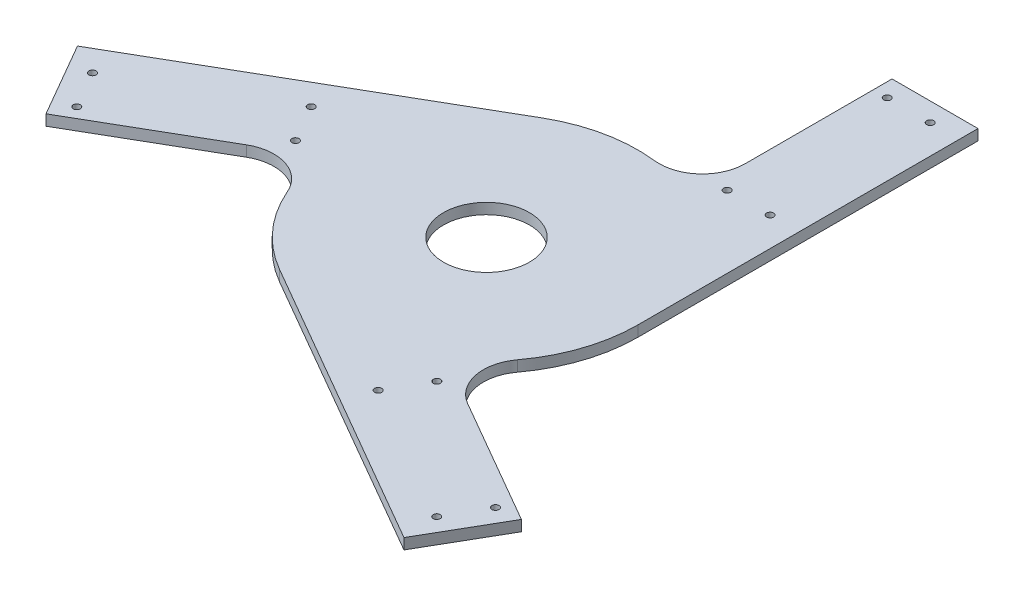
ISO-10303-21;
HEADER;
FILE_DESCRIPTION(('STEP AP214'),'2;1');
FILE_NAME('part.step','',(''),(''),'','','');
FILE_SCHEMA(('AUTOMOTIVE_DESIGN { 1 0 10303 214 1 1 1 1 }'));
ENDSEC;
DATA;
#1=APPLICATION_CONTEXT('core data for automotive mechanical design processes');
#2=APPLICATION_PROTOCOL_DEFINITION('international standard','automotive_design',2000,#1);
#3=PRODUCT_CONTEXT('',#1,'mechanical');
#4=PRODUCT('Part','Part','',(#3));
#5=PRODUCT_RELATED_PRODUCT_CATEGORY('part','',(#4));
#6=PRODUCT_DEFINITION_FORMATION('','',#4);
#7=PRODUCT_DEFINITION_CONTEXT('part definition',#1,'design');
#8=PRODUCT_DEFINITION('design','',#6,#7);
#9=PRODUCT_DEFINITION_SHAPE('','',#8);
#10=(LENGTH_UNIT() NAMED_UNIT(*) SI_UNIT(.MILLI.,.METRE.));
#11=(NAMED_UNIT(*) PLANE_ANGLE_UNIT() SI_UNIT($,.RADIAN.));
#12=(NAMED_UNIT(*) SI_UNIT($,.STERADIAN.) SOLID_ANGLE_UNIT());
#13=UNCERTAINTY_MEASURE_WITH_UNIT(LENGTH_MEASURE(1.E-05),#10,'distance_accuracy_value','');
#14=(GEOMETRIC_REPRESENTATION_CONTEXT(3) GLOBAL_UNCERTAINTY_ASSIGNED_CONTEXT((#13)) GLOBAL_UNIT_ASSIGNED_CONTEXT((#10,
#11,#12)) REPRESENTATION_CONTEXT('',''));
#15=CARTESIAN_POINT('',(0.,0.,0.));
#16=DIRECTION('',(0.,0.,1.));
#17=DIRECTION('',(1.,0.,0.));
#18=AXIS2_PLACEMENT_3D('',#15,#16,#17);
#19=CARTESIAN_POINT('',(30.51,5.,0.));
#20=DIRECTION('',(-1.,0.,0.));
#21=DIRECTION('',(0.,0.,1.));
#22=AXIS2_PLACEMENT_3D('',#19,#20,#21);
#23=PLANE('',#22);
#24=DIRECTION('',(0.,0.,-1.));
#25=VECTOR('',#24,1.);
#26=CARTESIAN_POINT('',(30.51,0.,0.));
#27=LINE('',#26,#25);
#28=CARTESIAN_POINT('',(30.51,0.,-89.8977196596221));
#29=VERTEX_POINT('',#28);
#30=CARTESIAN_POINT('',(30.51,0.,-158.25));
#31=VERTEX_POINT('',#30);
#32=EDGE_CURVE('E176',#29,#31,#27,.T.);
#33=ORIENTED_EDGE('',*,*,#32,.F.);
#34=DIRECTION('',(0.,-1.,0.));
#35=VECTOR('',#34,1.);
#36=CARTESIAN_POINT('',(30.51,5.,-89.8977196596221));
#37=LINE('',#36,#35);
#38=CARTESIAN_POINT('',(30.51,5.,-89.8977196596221));
#39=VERTEX_POINT('',#38);
#40=EDGE_CURVE('E11',#39,#29,#37,.T.);
#41=ORIENTED_EDGE('',*,*,#40,.F.);
#42=DIRECTION('',(0.,0.,-1.));
#43=VECTOR('',#42,1.);
#44=CARTESIAN_POINT('',(30.51,5.,0.));
#45=LINE('',#44,#43);
#46=CARTESIAN_POINT('',(30.51,5.,-158.25));
#47=VERTEX_POINT('',#46);
#48=EDGE_CURVE('E208',#39,#47,#45,.T.);
#49=ORIENTED_EDGE('',*,*,#48,.T.);
#50=DIRECTION('',(0.,-1.,0.));
#51=VECTOR('',#50,1.);
#52=CARTESIAN_POINT('',(30.51,5.,-158.25));
#53=LINE('',#52,#51);
#54=EDGE_CURVE('E55',#47,#31,#53,.T.);
#55=ORIENTED_EDGE('',*,*,#54,.T.);
#56=EDGE_LOOP('',(#33,#41,#49,#55));
#57=FACE_BOUND('',#56,.T.);
#58=ADVANCED_FACE('F39',(#57),#23,.T.);
#59=CARTESIAN_POINT('',(10.51,5.,-89.8977196596221));
#60=DIRECTION('',(0.,-1.,0.));
#61=DIRECTION('',(0.,0.,-1.));
#62=AXIS2_PLACEMENT_3D('',#59,#60,#61);
#63=CYLINDRICAL_SURFACE('',#62,20.);
#64=CARTESIAN_POINT('',(10.51,0.,-89.8977196596221));
#65=DIRECTION('',(0.,1.,0.));
#66=DIRECTION('',(0.,0.,1.));
#67=AXIS2_PLACEMENT_3D('',#64,#65,#66);
#68=CIRCLE('',#67,20.);
#69=CARTESIAN_POINT('',(8.18760468456525,0.,-70.0330152822887));
#70=VERTEX_POINT('',#69);
#71=EDGE_CURVE('E178',#70,#29,#68,.T.);
#72=ORIENTED_EDGE('',*,*,#71,.F.);
#73=DIRECTION('',(0.,-1.,0.));
#74=VECTOR('',#73,1.);
#75=CARTESIAN_POINT('',(8.18760468456525,5.,-70.0330152822887));
#76=LINE('',#75,#74);
#77=CARTESIAN_POINT('',(8.18760468456525,5.,-70.0330152822887));
#78=VERTEX_POINT('',#77);
#79=EDGE_CURVE('E47',#78,#70,#76,.T.);
#80=ORIENTED_EDGE('',*,*,#79,.F.);
#81=CARTESIAN_POINT('',(10.51,5.,-89.8977196596221));
#82=DIRECTION('',(0.,1.,0.));
#83=DIRECTION('',(0.,0.,1.));
#84=AXIS2_PLACEMENT_3D('',#81,#82,#83);
#85=CIRCLE('',#84,20.);
#86=EDGE_CURVE('E251',#78,#39,#85,.T.);
#87=ORIENTED_EDGE('',*,*,#86,.T.);
#88=ORIENTED_EDGE('',*,*,#40,.T.);
#89=EDGE_LOOP('',(#72,#80,#87,#88));
#90=FACE_BOUND('',#89,.T.);
#91=ADVANCED_FACE('F250',(#90),#63,.F.);
#92=CARTESIAN_POINT('',(0.,5.,0.));
#93=DIRECTION('',(0.,-1.,0.));
#94=DIRECTION('',(0.,0.,-1.));
#95=AXIS2_PLACEMENT_3D('',#92,#93,#94);
#96=CYLINDRICAL_SURFACE('',#95,70.51);
#97=CARTESIAN_POINT('',(0.,0.,0.));
#98=DIRECTION('',(0.,1.,0.));
#99=DIRECTION('',(0.,0.,1.));
#100=AXIS2_PLACEMENT_3D('',#97,#98,#99);
#101=CIRCLE('',#100,70.51);
#102=CARTESIAN_POINT('',(-35.255,0.,-61.0634512208408));
#103=VERTEX_POINT('',#102);
#104=EDGE_CURVE('E182',#70,#103,#101,.T.);
#105=ORIENTED_EDGE('',*,*,#104,.T.);
#106=DIRECTION('',(0.,-1.,0.));
#107=VECTOR('',#106,1.);
#108=CARTESIAN_POINT('',(-35.255,5.,-61.0634512208408));
#109=LINE('',#108,#107);
#110=CARTESIAN_POINT('',(-35.255,5.,-61.0634512208408));
#111=VERTEX_POINT('',#110);
#112=EDGE_CURVE('E235',#111,#103,#109,.T.);
#113=ORIENTED_EDGE('',*,*,#112,.F.);
#114=CARTESIAN_POINT('',(0.,5.,0.));
#115=DIRECTION('',(0.,1.,0.));
#116=DIRECTION('',(0.,0.,1.));
#117=AXIS2_PLACEMENT_3D('',#114,#115,#116);
#118=CIRCLE('',#117,70.51);
#119=EDGE_CURVE('E159',#78,#111,#118,.T.);
#120=ORIENTED_EDGE('',*,*,#119,.F.);
#121=ORIENTED_EDGE('',*,*,#79,.T.);
#122=EDGE_LOOP('',(#105,#113,#120,#121));
#123=FACE_BOUND('',#122,.T.);
#124=ADVANCED_FACE('F240',(#123),#96,.T.);
#125=CARTESIAN_POINT('',(-35.255,5.,-61.0634512208408));
#126=DIRECTION('',(0.5,0.,0.866025403784439));
#127=DIRECTION('',(0.866025403784439,0.,-0.5));
#128=AXIS2_PLACEMENT_3D('',#125,#126,#127);
#129=PLANE('',#128);
#130=DIRECTION('',(-0.866025403784439,0.,0.5));
#131=VECTOR('',#130,1.);
#132=CARTESIAN_POINT('',(-35.255,0.,-61.0634512208408));
#133=LINE('',#132,#131);
#134=CARTESIAN_POINT('',(-172.303520148887,0.,18.0615487791592));
#135=VERTEX_POINT('',#134);
#136=EDGE_CURVE('E184',#103,#135,#133,.T.);
#137=ORIENTED_EDGE('',*,*,#136,.T.);
#138=DIRECTION('',(0.,-1.,0.));
#139=VECTOR('',#138,1.);
#140=CARTESIAN_POINT('',(-172.303520148887,5.,18.0615487791592));
#141=LINE('',#140,#139);
#142=CARTESIAN_POINT('',(-172.303520148887,5.,18.0615487791592));
#143=VERTEX_POINT('',#142);
#144=EDGE_CURVE('E232',#143,#135,#141,.T.);
#145=ORIENTED_EDGE('',*,*,#144,.F.);
#146=DIRECTION('',(-0.866025403784439,0.,0.5));
#147=VECTOR('',#146,1.);
#148=CARTESIAN_POINT('',(-35.255,5.,-61.0634512208408));
#149=LINE('',#148,#147);
#150=EDGE_CURVE('E337',#111,#143,#149,.T.);
#151=ORIENTED_EDGE('',*,*,#150,.F.);
#152=ORIENTED_EDGE('',*,*,#112,.T.);
#153=EDGE_LOOP('',(#137,#145,#151,#152));
#154=FACE_BOUND('',#153,.T.);
#155=ADVANCED_FACE('F270',(#154),#129,.F.);
#156=CARTESIAN_POINT('',(-137.048520148887,5.,79.125));
#157=DIRECTION('',(0.866025403784438,0.,-0.5));
#158=DIRECTION('',(-0.5,0.,-0.866025403784438));
#159=AXIS2_PLACEMENT_3D('',#156,#157,#158);
#160=PLANE('',#159);
#161=DIRECTION('',(0.5,0.,0.866025403784438));
#162=VECTOR('',#161,1.);
#163=CARTESIAN_POINT('',(-137.048520148887,0.,79.125));
#164=LINE('',#163,#162);
#165=CARTESIAN_POINT('',(-152.303520148887,0.,52.7025649305367));
#166=VERTEX_POINT('',#165);
#167=EDGE_CURVE('E187',#135,#166,#164,.T.);
#168=ORIENTED_EDGE('',*,*,#167,.T.);
#169=DIRECTION('',(0.,-1.,0.));
#170=VECTOR('',#169,1.);
#171=CARTESIAN_POINT('',(-152.303520148887,5.,52.7025649305367));
#172=LINE('',#171,#170);
#173=CARTESIAN_POINT('',(-152.303520148887,5.,52.7025649305367));
#174=VERTEX_POINT('',#173);
#175=EDGE_CURVE('E229',#174,#166,#172,.T.);
#176=ORIENTED_EDGE('',*,*,#175,.F.);
#177=DIRECTION('',(0.5,0.,0.866025403784438));
#178=VECTOR('',#177,1.);
#179=CARTESIAN_POINT('',(-137.048520148887,5.,79.125));
#180=LINE('',#179,#178);
#181=EDGE_CURVE('E335',#143,#174,#180,.T.);
#182=ORIENTED_EDGE('',*,*,#181,.F.);
#183=ORIENTED_EDGE('',*,*,#144,.T.);
#184=EDGE_LOOP('',(#168,#176,#182,#183));
#185=FACE_BOUND('',#184,.T.);
#186=ADVANCED_FACE('F276',(#185),#160,.F.);
#187=CARTESIAN_POINT('',(-15.255,5.,-26.4224350694632));
#188=DIRECTION('',(-0.5,0.,-0.866025403784439));
#189=DIRECTION('',(-0.866025403784439,0.,0.5));
#190=AXIS2_PLACEMENT_3D('',#187,#188,#189);
#191=PLANE('',#190);
#192=DIRECTION('',(0.866025403784439,0.,-0.5));
#193=VECTOR('',#192,1.);
#194=CARTESIAN_POINT('',(-15.255,0.,-26.4224350694632));
#195=LINE('',#194,#193);
#196=CARTESIAN_POINT('',(-93.1087089675245,0.,18.5264247603478));
#197=VERTEX_POINT('',#196);
#198=EDGE_CURVE('E189',#166,#197,#195,.T.);
#199=ORIENTED_EDGE('',*,*,#198,.T.);
#200=DIRECTION('',(0.,-1.,0.));
#201=VECTOR('',#200,1.);
#202=CARTESIAN_POINT('',(-93.1087089675245,5.,18.5264247603478));
#203=LINE('',#202,#201);
#204=CARTESIAN_POINT('',(-93.1087089675245,5.,18.5264247603478));
#205=VERTEX_POINT('',#204);
#206=EDGE_CURVE('E226',#205,#197,#203,.T.);
#207=ORIENTED_EDGE('',*,*,#206,.F.);
#208=DIRECTION('',(0.866025403784439,0.,-0.5));
#209=VECTOR('',#208,1.);
#210=CARTESIAN_POINT('',(-15.255,5.,-26.4224350694632));
#211=LINE('',#210,#209);
#212=EDGE_CURVE('E333',#174,#205,#211,.T.);
#213=ORIENTED_EDGE('',*,*,#212,.F.);
#214=ORIENTED_EDGE('',*,*,#175,.T.);
#215=EDGE_LOOP('',(#199,#207,#213,#214));
#216=FACE_BOUND('',#215,.T.);
#217=ADVANCED_FACE('F280',(#216),#191,.F.);
#218=CARTESIAN_POINT('',(-83.1087089675245,5.,35.8469328360366));
#219=DIRECTION('',(0.,-1.,0.));
#220=DIRECTION('',(0.,0.,-1.));
#221=AXIS2_PLACEMENT_3D('',#218,#219,#220);
#222=CYLINDRICAL_SURFACE('',#221,20.);
#223=CARTESIAN_POINT('',(-83.1087089675245,0.,35.8469328360366));
#224=DIRECTION('',(0.,1.,0.));
#225=DIRECTION('',(0.,0.,1.));
#226=AXIS2_PLACEMENT_3D('',#223,#224,#225);
#227=CIRCLE('',#226,20.);
#228=CARTESIAN_POINT('',(-64.7441726803685,0.,27.9258339881664));
#229=VERTEX_POINT('',#228);
#230=EDGE_CURVE('E191',#197,#229,#227,.F.);
#231=ORIENTED_EDGE('',*,*,#230,.T.);
#232=DIRECTION('',(0.,-1.,0.));
#233=VECTOR('',#232,1.);
#234=CARTESIAN_POINT('',(-64.7441726803685,5.,27.9258339881664));
#235=LINE('',#234,#233);
#236=CARTESIAN_POINT('',(-64.7441726803685,5.,27.9258339881664));
#237=VERTEX_POINT('',#236);
#238=EDGE_CURVE('E223',#237,#229,#235,.T.);
#239=ORIENTED_EDGE('',*,*,#238,.F.);
#240=CARTESIAN_POINT('',(-83.1087089675245,5.,35.8469328360366));
#241=DIRECTION('',(0.,1.,0.));
#242=DIRECTION('',(0.,0.,1.));
#243=AXIS2_PLACEMENT_3D('',#240,#241,#242);
#244=CIRCLE('',#243,20.);
#245=EDGE_CURVE('E331',#205,#237,#244,.F.);
#246=ORIENTED_EDGE('',*,*,#245,.F.);
#247=ORIENTED_EDGE('',*,*,#206,.T.);
#248=EDGE_LOOP('',(#231,#239,#246,#247));
#249=FACE_BOUND('',#248,.T.);
#250=ADVANCED_FACE('F284',(#249),#222,.F.);
#251=CARTESIAN_POINT('',(-35.2549999999998,0.,61.0634512208409));
#252=VERTEX_POINT('',#251);
#253=EDGE_CURVE('E185',#229,#252,#101,.T.);
#254=ORIENTED_EDGE('',*,*,#253,.T.);
#255=DIRECTION('',(0.,-1.,0.));
#256=VECTOR('',#255,1.);
#257=CARTESIAN_POINT('',(-35.2549999999998,5.,61.0634512208409));
#258=LINE('',#257,#256);
#259=CARTESIAN_POINT('',(-35.2549999999998,5.,61.0634512208409));
#260=VERTEX_POINT('',#259);
#261=EDGE_CURVE('E220',#260,#252,#258,.T.);
#262=ORIENTED_EDGE('',*,*,#261,.F.);
#263=EDGE_CURVE('E158',#237,#260,#118,.T.);
#264=ORIENTED_EDGE('',*,*,#263,.F.);
#265=ORIENTED_EDGE('',*,*,#238,.T.);
#266=EDGE_LOOP('',(#254,#262,#264,#265));
#267=FACE_BOUND('',#266,.T.);
#268=ADVANCED_FACE('F272',(#267),#96,.T.);
#269=CARTESIAN_POINT('',(-35.2549999999998,5.,61.0634512208409));
#270=DIRECTION('',(0.499999999999998,0.,-0.86602540378444));
#271=DIRECTION('',(-0.86602540378444,0.,-0.499999999999998));
#272=AXIS2_PLACEMENT_3D('',#269,#270,#271);
#273=PLANE('',#272);
#274=DIRECTION('',(0.86602540378444,0.,0.499999999999998));
#275=VECTOR('',#274,1.);
#276=CARTESIAN_POINT('',(-35.2549999999998,0.,61.0634512208409));
#277=LINE('',#276,#275);
#278=CARTESIAN_POINT('',(101.793520148888,0.,140.188451220841));
#279=VERTEX_POINT('',#278);
#280=EDGE_CURVE('E193',#252,#279,#277,.T.);
#281=ORIENTED_EDGE('',*,*,#280,.T.);
#282=DIRECTION('',(0.,-1.,0.));
#283=VECTOR('',#282,1.);
#284=CARTESIAN_POINT('',(101.793520148888,5.,140.188451220841));
#285=LINE('',#284,#283);
#286=CARTESIAN_POINT('',(101.793520148888,5.,140.188451220841));
#287=VERTEX_POINT('',#286);
#288=EDGE_CURVE('E217',#287,#279,#285,.T.);
#289=ORIENTED_EDGE('',*,*,#288,.F.);
#290=DIRECTION('',(0.86602540378444,0.,0.499999999999998));
#291=VECTOR('',#290,1.);
#292=CARTESIAN_POINT('',(-35.2549999999998,5.,61.0634512208409));
#293=LINE('',#292,#291);
#294=EDGE_CURVE('E319',#260,#287,#293,.T.);
#295=ORIENTED_EDGE('',*,*,#294,.F.);
#296=ORIENTED_EDGE('',*,*,#261,.T.);
#297=EDGE_LOOP('',(#281,#289,#295,#296));
#298=FACE_BOUND('',#297,.T.);
#299=ADVANCED_FACE('F289',(#298),#273,.F.);
#300=CARTESIAN_POINT('',(137.048520148888,5.,79.1249999999997));
#301=DIRECTION('',(-0.86602540378444,0.,-0.499999999999998));
#302=DIRECTION('',(-0.499999999999998,0.,0.86602540378444));
#303=AXIS2_PLACEMENT_3D('',#300,#301,#302);
#304=PLANE('',#303);
#305=DIRECTION('',(0.499999999999998,0.,-0.86602540378444));
#306=VECTOR('',#305,1.);
#307=CARTESIAN_POINT('',(137.048520148888,0.,79.1249999999997));
#308=LINE('',#307,#306);
#309=CARTESIAN_POINT('',(121.793520148888,0.,105.547435069463));
#310=VERTEX_POINT('',#309);
#311=EDGE_CURVE('E195',#279,#310,#308,.T.);
#312=ORIENTED_EDGE('',*,*,#311,.T.);
#313=DIRECTION('',(0.,-1.,0.));
#314=VECTOR('',#313,1.);
#315=CARTESIAN_POINT('',(121.793520148888,5.,105.547435069463));
#316=LINE('',#315,#314);
#317=CARTESIAN_POINT('',(121.793520148888,5.,105.547435069463));
#318=VERTEX_POINT('',#317);
#319=EDGE_CURVE('E214',#318,#310,#316,.T.);
#320=ORIENTED_EDGE('',*,*,#319,.F.);
#321=DIRECTION('',(0.499999999999998,0.,-0.86602540378444));
#322=VECTOR('',#321,1.);
#323=CARTESIAN_POINT('',(137.048520148888,5.,79.1249999999997));
#324=LINE('',#323,#322);
#325=EDGE_CURVE('E327',#287,#318,#324,.T.);
#326=ORIENTED_EDGE('',*,*,#325,.F.);
#327=ORIENTED_EDGE('',*,*,#288,.T.);
#328=EDGE_LOOP('',(#312,#320,#326,#327));
#329=FACE_BOUND('',#328,.T.);
#330=ADVANCED_FACE('F292',(#329),#304,.F.);
#331=CARTESIAN_POINT('',(-15.2549999999999,5.,26.4224350694633));
#332=DIRECTION('',(-0.499999999999998,0.,0.86602540378444));
#333=DIRECTION('',(0.86602540378444,0.,0.499999999999998));
#334=AXIS2_PLACEMENT_3D('',#331,#332,#333);
#335=PLANE('',#334);
#336=DIRECTION('',(-0.86602540378444,0.,-0.499999999999998));
#337=VECTOR('',#336,1.);
#338=CARTESIAN_POINT('',(-15.2549999999999,0.,26.4224350694633));
#339=LINE('',#338,#337);
#340=CARTESIAN_POINT('',(62.5987089675247,0.,71.3712948992741));
#341=VERTEX_POINT('',#340);
#342=EDGE_CURVE('E197',#310,#341,#339,.T.);
#343=ORIENTED_EDGE('',*,*,#342,.T.);
#344=DIRECTION('',(0.,-1.,0.));
#345=VECTOR('',#344,1.);
#346=CARTESIAN_POINT('',(62.5987089675247,5.,71.3712948992741));
#347=LINE('',#346,#345);
#348=CARTESIAN_POINT('',(62.5987089675247,5.,71.3712948992741));
#349=VERTEX_POINT('',#348);
#350=EDGE_CURVE('E212',#349,#341,#347,.T.);
#351=ORIENTED_EDGE('',*,*,#350,.F.);
#352=DIRECTION('',(-0.86602540378444,0.,-0.499999999999998));
#353=VECTOR('',#352,1.);
#354=CARTESIAN_POINT('',(-15.2549999999999,5.,26.4224350694633));
#355=LINE('',#354,#353);
#356=EDGE_CURVE('E326',#318,#349,#355,.T.);
#357=ORIENTED_EDGE('',*,*,#356,.F.);
#358=ORIENTED_EDGE('',*,*,#319,.T.);
#359=EDGE_LOOP('',(#343,#351,#357,#358));
#360=FACE_BOUND('',#359,.T.);
#361=ADVANCED_FACE('F296',(#360),#335,.F.);
#362=CARTESIAN_POINT('',(72.5987089675246,5.,54.0507868235853));
#363=DIRECTION('',(0.,-1.,0.));
#364=DIRECTION('',(0.,0.,-1.));
#365=AXIS2_PLACEMENT_3D('',#362,#363,#364);
#366=CYLINDRICAL_SURFACE('',#365,20.);
#367=CARTESIAN_POINT('',(72.5987089675246,0.,54.0507868235853));
#368=DIRECTION('',(0.,1.,0.));
#369=DIRECTION('',(0.,0.,1.));
#370=AXIS2_PLACEMENT_3D('',#367,#368,#369);
#371=CIRCLE('',#370,20.);
#372=CARTESIAN_POINT('',(56.5565679958033,0.,42.1071812941222));
#373=VERTEX_POINT('',#372);
#374=EDGE_CURVE('E200',#373,#341,#371,.T.);
#375=ORIENTED_EDGE('',*,*,#374,.F.);
#376=DIRECTION('',(0.,-1.,0.));
#377=VECTOR('',#376,1.);
#378=CARTESIAN_POINT('',(56.5565679958033,5.,42.1071812941222));
#379=LINE('',#378,#377);
#380=CARTESIAN_POINT('',(56.5565679958033,5.,42.1071812941222));
#381=VERTEX_POINT('',#380);
#382=EDGE_CURVE('E167',#381,#373,#379,.T.);
#383=ORIENTED_EDGE('',*,*,#382,.F.);
#384=CARTESIAN_POINT('',(72.5987089675246,5.,54.0507868235853));
#385=DIRECTION('',(0.,1.,0.));
#386=DIRECTION('',(0.,0.,1.));
#387=AXIS2_PLACEMENT_3D('',#384,#385,#386);
#388=CIRCLE('',#387,20.);
#389=EDGE_CURVE('E155',#381,#349,#388,.T.);
#390=ORIENTED_EDGE('',*,*,#389,.T.);
#391=ORIENTED_EDGE('',*,*,#350,.T.);
#392=EDGE_LOOP('',(#375,#383,#390,#391));
#393=FACE_BOUND('',#392,.T.);
#394=ADVANCED_FACE('F300',(#393),#366,.F.);
#395=CARTESIAN_POINT('',(70.51,0.,0.));
#396=VERTEX_POINT('',#395);
#397=EDGE_CURVE('E164',#373,#396,#101,.T.);
#398=ORIENTED_EDGE('',*,*,#397,.T.);
#399=DIRECTION('',(0.,-1.,0.));
#400=VECTOR('',#399,1.);
#401=CARTESIAN_POINT('',(70.51,5.,0.));
#402=LINE('',#401,#400);
#403=CARTESIAN_POINT('',(70.51,5.,0.));
#404=VERTEX_POINT('',#403);
#405=EDGE_CURVE('E161',#404,#396,#402,.T.);
#406=ORIENTED_EDGE('',*,*,#405,.F.);
#407=EDGE_CURVE('E148',#381,#404,#118,.T.);
#408=ORIENTED_EDGE('',*,*,#407,.F.);
#409=ORIENTED_EDGE('',*,*,#382,.T.);
#410=EDGE_LOOP('',(#398,#406,#408,#409));
#411=FACE_BOUND('',#410,.T.);
#412=ADVANCED_FACE('F162',(#411),#96,.T.);
#413=CARTESIAN_POINT('',(70.51,5.,0.));
#414=DIRECTION('',(1.,0.,0.));
#415=DIRECTION('',(0.,0.,-1.));
#416=AXIS2_PLACEMENT_3D('',#413,#414,#415);
#417=PLANE('',#416);
#418=DIRECTION('',(0.,0.,1.));
#419=VECTOR('',#418,1.);
#420=CARTESIAN_POINT('',(70.51,0.,0.));
#421=LINE('',#420,#419);
#422=CARTESIAN_POINT('',(70.51,0.,-158.25));
#423=VERTEX_POINT('',#422);
#424=EDGE_CURVE('E203',#423,#396,#421,.T.);
#425=ORIENTED_EDGE('',*,*,#424,.F.);
#426=DIRECTION('',(0.,-1.,0.));
#427=VECTOR('',#426,1.);
#428=CARTESIAN_POINT('',(70.51,5.,-158.25));
#429=LINE('',#428,#427);
#430=CARTESIAN_POINT('',(70.51,5.,-158.25));
#431=VERTEX_POINT('',#430);
#432=EDGE_CURVE('E101',#431,#423,#429,.T.);
#433=ORIENTED_EDGE('',*,*,#432,.F.);
#434=DIRECTION('',(0.,0.,1.));
#435=VECTOR('',#434,1.);
#436=CARTESIAN_POINT('',(70.51,5.,0.));
#437=LINE('',#436,#435);
#438=EDGE_CURVE('E153',#431,#404,#437,.T.);
#439=ORIENTED_EDGE('',*,*,#438,.T.);
#440=ORIENTED_EDGE('',*,*,#405,.T.);
#441=EDGE_LOOP('',(#425,#433,#439,#440));
#442=FACE_BOUND('',#441,.T.);
#443=ADVANCED_FACE('F169',(#442),#417,.T.);
#444=CARTESIAN_POINT('',(0.,5.,-158.25));
#445=DIRECTION('',(0.,0.,-1.));
#446=DIRECTION('',(-1.,0.,0.));
#447=AXIS2_PLACEMENT_3D('',#444,#445,#446);
#448=PLANE('',#447);
#449=DIRECTION('',(1.,0.,0.));
#450=VECTOR('',#449,1.);
#451=CARTESIAN_POINT('',(0.,0.,-158.25));
#452=LINE('',#451,#450);
#453=EDGE_CURVE('E205',#31,#423,#452,.T.);
#454=ORIENTED_EDGE('',*,*,#453,.F.);
#455=ORIENTED_EDGE('',*,*,#54,.F.);
#456=DIRECTION('',(1.,0.,0.));
#457=VECTOR('',#456,1.);
#458=CARTESIAN_POINT('',(0.,5.,-158.25));
#459=LINE('',#458,#457);
#460=EDGE_CURVE('E170',#47,#431,#459,.T.);
#461=ORIENTED_EDGE('',*,*,#460,.T.);
#462=ORIENTED_EDGE('',*,*,#432,.T.);
#463=EDGE_LOOP('',(#454,#455,#461,#462));
#464=FACE_BOUND('',#463,.T.);
#465=ADVANCED_FACE('F252',(#464),#448,.T.);
#466=CARTESIAN_POINT('',(0.,5.,0.));
#467=DIRECTION('',(0.,1.,0.));
#468=DIRECTION('',(0.,0.,1.));
#469=AXIS2_PLACEMENT_3D('',#466,#467,#468);
#470=PLANE('',#469);
#471=CARTESIAN_POINT('',(57.01,5.,-149.5));
#472=DIRECTION('',(0.,1.,0.));
#473=DIRECTION('',(0.,0.,1.));
#474=AXIS2_PLACEMENT_3D('',#471,#472,#473);
#475=CIRCLE('',#474,1.65);
#476=CARTESIAN_POINT('',(57.01,5.,-147.85));
#477=VERTEX_POINT('',#476);
#478=EDGE_CURVE('E415',#477,#477,#475,.T.);
#479=ORIENTED_EDGE('',*,*,#478,.F.);
#480=EDGE_LOOP('',(#479));
#481=FACE_BOUND('',#480,.T.);
#482=CARTESIAN_POINT('',(37.01,5.,-75.));
#483=DIRECTION('',(0.,1.,0.));
#484=DIRECTION('',(0.,0.,1.));
#485=AXIS2_PLACEMENT_3D('',#482,#483,#484);
#486=CIRCLE('',#485,1.65);
#487=CARTESIAN_POINT('',(37.01,5.,-73.35));
#488=VERTEX_POINT('',#487);
#489=EDGE_CURVE('E409',#488,#488,#486,.T.);
#490=ORIENTED_EDGE('',*,*,#489,.F.);
#491=EDGE_LOOP('',(#490));
#492=FACE_BOUND('',#491,.T.);
#493=CARTESIAN_POINT('',(37.01,5.,-149.5));
#494=DIRECTION('',(0.,1.,0.));
#495=DIRECTION('',(0.,0.,1.));
#496=AXIS2_PLACEMENT_3D('',#493,#494,#495);
#497=CIRCLE('',#496,1.65);
#498=CARTESIAN_POINT('',(37.01,5.,-147.85));
#499=VERTEX_POINT('',#498);
#500=EDGE_CURVE('E403',#499,#499,#497,.T.);
#501=ORIENTED_EDGE('',*,*,#500,.F.);
#502=EDGE_LOOP('',(#501));
#503=FACE_BOUND('',#502,.T.);
#504=CARTESIAN_POINT('',(57.01,5.,-75.));
#505=DIRECTION('',(0.,1.,0.));
#506=DIRECTION('',(0.,0.,1.));
#507=AXIS2_PLACEMENT_3D('',#504,#505,#506);
#508=CIRCLE('',#507,1.65);
#509=CARTESIAN_POINT('',(57.01,5.,-73.35));
#510=VERTEX_POINT('',#509);
#511=EDGE_CURVE('E397',#510,#510,#508,.T.);
#512=ORIENTED_EDGE('',*,*,#511,.F.);
#513=EDGE_LOOP('',(#512));
#514=FACE_BOUND('',#513,.T.);
#515=CARTESIAN_POINT('',(100.965797865794,5.,124.122108269751));
#516=DIRECTION('',(0.,1.,0.));
#517=DIRECTION('',(0.,0.,1.));
#518=AXIS2_PLACEMENT_3D('',#515,#516,#517);
#519=CIRCLE('',#518,1.65);
#520=CARTESIAN_POINT('',(100.965797865794,5.,125.772108269751));
#521=VERTEX_POINT('',#520);
#522=EDGE_CURVE('E391',#521,#521,#519,.T.);
#523=ORIENTED_EDGE('',*,*,#522,.F.);
#524=EDGE_LOOP('',(#523));
#525=FACE_BOUND('',#524,.T.);
#526=CARTESIAN_POINT('',(46.4469052838537,5.,69.5516001940621));
#527=DIRECTION('',(0.,1.,0.));
#528=DIRECTION('',(0.,0.,1.));
#529=AXIS2_PLACEMENT_3D('',#526,#527,#528);
#530=CIRCLE('',#529,1.65);
#531=CARTESIAN_POINT('',(46.4469052838537,5.,71.2016001940621));
#532=VERTEX_POINT('',#531);
#533=EDGE_CURVE('E385',#532,#532,#530,.T.);
#534=ORIENTED_EDGE('',*,*,#533,.F.);
#535=EDGE_LOOP('',(#534));
#536=FACE_BOUND('',#535,.T.);
#537=CARTESIAN_POINT('',(110.965797865794,5.,106.801600194062));
#538=DIRECTION('',(0.,1.,0.));
#539=DIRECTION('',(0.,0.,1.));
#540=AXIS2_PLACEMENT_3D('',#537,#538,#539);
#541=CIRCLE('',#540,1.65);
#542=CARTESIAN_POINT('',(110.965797865794,5.,108.451600194062));
#543=VERTEX_POINT('',#542);
#544=EDGE_CURVE('E379',#543,#543,#541,.T.);
#545=ORIENTED_EDGE('',*,*,#544,.F.);
#546=EDGE_LOOP('',(#545));
#547=FACE_BOUND('',#546,.T.);
#548=CARTESIAN_POINT('',(36.4469052838537,5.,86.8721082697509));
#549=DIRECTION('',(0.,1.,0.));
#550=DIRECTION('',(0.,0.,1.));
#551=AXIS2_PLACEMENT_3D('',#548,#549,#550);
#552=CIRCLE('',#551,1.65);
#553=CARTESIAN_POINT('',(36.4469052838537,5.,88.5221082697509));
#554=VERTEX_POINT('',#553);
#555=EDGE_CURVE('E373',#554,#554,#552,.T.);
#556=ORIENTED_EDGE('',*,*,#555,.F.);
#557=EDGE_LOOP('',(#556));
#558=FACE_BOUND('',#557,.T.);
#559=CARTESIAN_POINT('',(-157.975797865763,5.,25.3778917302671));
#560=DIRECTION('',(0.,1.,0.));
#561=DIRECTION('',(0.,0.,1.));
#562=AXIS2_PLACEMENT_3D('',#559,#560,#561);
#563=CIRCLE('',#562,1.65000000000001);
#564=CARTESIAN_POINT('',(-157.975797865763,5.,27.0278917302672));
#565=VERTEX_POINT('',#564);
#566=EDGE_CURVE('E367',#565,#565,#563,.T.);
#567=ORIENTED_EDGE('',*,*,#566,.F.);
#568=EDGE_LOOP('',(#567));
#569=FACE_BOUND('',#568,.T.);
#570=CARTESIAN_POINT('',(-83.4569052838226,5.,5.44839980595592));
#571=DIRECTION('',(0.,1.,0.));
#572=DIRECTION('',(0.,0.,1.));
#573=AXIS2_PLACEMENT_3D('',#570,#571,#572);
#574=CIRCLE('',#573,1.65);
#575=CARTESIAN_POINT('',(-83.4569052838226,5.,7.09839980595592));
#576=VERTEX_POINT('',#575);
#577=EDGE_CURVE('E361',#576,#576,#574,.T.);
#578=ORIENTED_EDGE('',*,*,#577,.F.);
#579=EDGE_LOOP('',(#578));
#580=FACE_BOUND('',#579,.T.);
#581=CARTESIAN_POINT('',(-147.975797865763,5.,42.6983998059559));
#582=DIRECTION('',(0.,1.,0.));
#583=DIRECTION('',(0.,0.,1.));
#584=AXIS2_PLACEMENT_3D('',#581,#582,#583);
#585=CIRCLE('',#584,1.65000000000001);
#586=CARTESIAN_POINT('',(-147.975797865763,5.,44.3483998059559));
#587=VERTEX_POINT('',#586);
#588=EDGE_CURVE('E355',#587,#587,#585,.T.);
#589=ORIENTED_EDGE('',*,*,#588,.F.);
#590=EDGE_LOOP('',(#589));
#591=FACE_BOUND('',#590,.T.);
#592=CARTESIAN_POINT('',(-93.4569052838226,5.,-11.8721082697329));
#593=DIRECTION('',(0.,1.,0.));
#594=DIRECTION('',(0.,0.,1.));
#595=AXIS2_PLACEMENT_3D('',#592,#593,#594);
#596=CIRCLE('',#595,1.65);
#597=CARTESIAN_POINT('',(-93.4569052838226,5.,-10.2221082697329));
#598=VERTEX_POINT('',#597);
#599=EDGE_CURVE('E349',#598,#598,#596,.T.);
#600=ORIENTED_EDGE('',*,*,#599,.F.);
#601=EDGE_LOOP('',(#600));
#602=FACE_BOUND('',#601,.T.);
#603=CARTESIAN_POINT('',(0.,5.,0.));
#604=DIRECTION('',(0.,1.,0.));
#605=DIRECTION('',(0.,0.,1.));
#606=AXIS2_PLACEMENT_3D('',#603,#604,#605);
#607=CIRCLE('',#606,20.);
#608=CARTESIAN_POINT('',(0.,5.,20.));
#609=VERTEX_POINT('',#608);
#610=EDGE_CURVE('E341',#609,#609,#607,.T.);
#611=ORIENTED_EDGE('',*,*,#610,.F.);
#612=EDGE_LOOP('',(#611));
#613=FACE_BOUND('',#612,.T.);
#614=ORIENTED_EDGE('',*,*,#48,.F.);
#615=ORIENTED_EDGE('',*,*,#86,.F.);
#616=ORIENTED_EDGE('',*,*,#119,.T.);
#617=ORIENTED_EDGE('',*,*,#150,.T.);
#618=ORIENTED_EDGE('',*,*,#181,.T.);
#619=ORIENTED_EDGE('',*,*,#212,.T.);
#620=ORIENTED_EDGE('',*,*,#245,.T.);
#621=ORIENTED_EDGE('',*,*,#263,.T.);
#622=ORIENTED_EDGE('',*,*,#294,.T.);
#623=ORIENTED_EDGE('',*,*,#325,.T.);
#624=ORIENTED_EDGE('',*,*,#356,.T.);
#625=ORIENTED_EDGE('',*,*,#389,.F.);
#626=ORIENTED_EDGE('',*,*,#407,.T.);
#627=ORIENTED_EDGE('',*,*,#438,.F.);
#628=ORIENTED_EDGE('',*,*,#460,.F.);
#629=EDGE_LOOP('',(#614,#615,#616,#617,#618,#619,#620,#621,#622,#623,#624,#625,#626,#627,#628));
#630=FACE_BOUND('',#629,.T.);
#631=ADVANCED_FACE('F150',(#481,#492,#503,#514,#525,#536,#547,#558,#569,#580,#591,#602,#613,
#630),#470,.T.);
#632=CARTESIAN_POINT('',(0.,0.,0.));
#633=DIRECTION('',(0.,1.,0.));
#634=DIRECTION('',(0.,0.,1.));
#635=AXIS2_PLACEMENT_3D('',#632,#633,#634);
#636=PLANE('',#635);
#637=CARTESIAN_POINT('',(57.01,0.,-149.5));
#638=DIRECTION('',(0.,1.,0.));
#639=DIRECTION('',(0.,0.,1.));
#640=AXIS2_PLACEMENT_3D('',#637,#638,#639);
#641=CIRCLE('',#640,1.64999999999998);
#642=CARTESIAN_POINT('',(57.01,0.,-147.85));
#643=VERTEX_POINT('',#642);
#644=EDGE_CURVE('E412',#643,#643,#641,.T.);
#645=ORIENTED_EDGE('',*,*,#644,.T.);
#646=EDGE_LOOP('',(#645));
#647=FACE_BOUND('',#646,.T.);
#648=CARTESIAN_POINT('',(37.01,0.,-75.));
#649=DIRECTION('',(0.,1.,0.));
#650=DIRECTION('',(0.,0.,1.));
#651=AXIS2_PLACEMENT_3D('',#648,#649,#650);
#652=CIRCLE('',#651,1.64999999999998);
#653=CARTESIAN_POINT('',(37.01,0.,-73.3500000000001));
#654=VERTEX_POINT('',#653);
#655=EDGE_CURVE('E406',#654,#654,#652,.T.);
#656=ORIENTED_EDGE('',*,*,#655,.T.);
#657=EDGE_LOOP('',(#656));
#658=FACE_BOUND('',#657,.T.);
#659=CARTESIAN_POINT('',(37.01,0.,-149.5));
#660=DIRECTION('',(0.,1.,0.));
#661=DIRECTION('',(0.,0.,1.));
#662=AXIS2_PLACEMENT_3D('',#659,#660,#661);
#663=CIRCLE('',#662,1.64999999999998);
#664=CARTESIAN_POINT('',(37.01,0.,-147.85));
#665=VERTEX_POINT('',#664);
#666=EDGE_CURVE('E400',#665,#665,#663,.T.);
#667=ORIENTED_EDGE('',*,*,#666,.T.);
#668=EDGE_LOOP('',(#667));
#669=FACE_BOUND('',#668,.T.);
#670=CARTESIAN_POINT('',(57.01,0.,-75.));
#671=DIRECTION('',(0.,1.,0.));
#672=DIRECTION('',(0.,0.,1.));
#673=AXIS2_PLACEMENT_3D('',#670,#671,#672);
#674=CIRCLE('',#673,1.64999999999998);
#675=CARTESIAN_POINT('',(57.01,0.,-73.3500000000001));
#676=VERTEX_POINT('',#675);
#677=EDGE_CURVE('E394',#676,#676,#674,.T.);
#678=ORIENTED_EDGE('',*,*,#677,.T.);
#679=EDGE_LOOP('',(#678));
#680=FACE_BOUND('',#679,.T.);
#681=CARTESIAN_POINT('',(100.965797865794,0.,124.122108269751));
#682=DIRECTION('',(0.,1.,0.));
#683=DIRECTION('',(0.,0.,1.));
#684=AXIS2_PLACEMENT_3D('',#681,#682,#683);
#685=CIRCLE('',#684,1.64999999999998);
#686=CARTESIAN_POINT('',(100.965797865794,0.,125.772108269751));
#687=VERTEX_POINT('',#686);
#688=EDGE_CURVE('E388',#687,#687,#685,.T.);
#689=ORIENTED_EDGE('',*,*,#688,.T.);
#690=EDGE_LOOP('',(#689));
#691=FACE_BOUND('',#690,.T.);
#692=CARTESIAN_POINT('',(46.4469052838537,0.,69.5516001940621));
#693=DIRECTION('',(0.,1.,0.));
#694=DIRECTION('',(0.,0.,1.));
#695=AXIS2_PLACEMENT_3D('',#692,#693,#694);
#696=CIRCLE('',#695,1.64999999999998);
#697=CARTESIAN_POINT('',(46.4469052838537,0.,71.2016001940621));
#698=VERTEX_POINT('',#697);
#699=EDGE_CURVE('E382',#698,#698,#696,.T.);
#700=ORIENTED_EDGE('',*,*,#699,.T.);
#701=EDGE_LOOP('',(#700));
#702=FACE_BOUND('',#701,.T.);
#703=CARTESIAN_POINT('',(110.965797865794,0.,106.801600194062));
#704=DIRECTION('',(0.,1.,0.));
#705=DIRECTION('',(0.,0.,1.));
#706=AXIS2_PLACEMENT_3D('',#703,#704,#705);
#707=CIRCLE('',#706,1.64999999999998);
#708=CARTESIAN_POINT('',(110.965797865794,0.,108.451600194062));
#709=VERTEX_POINT('',#708);
#710=EDGE_CURVE('E376',#709,#709,#707,.T.);
#711=ORIENTED_EDGE('',*,*,#710,.T.);
#712=EDGE_LOOP('',(#711));
#713=FACE_BOUND('',#712,.T.);
#714=CARTESIAN_POINT('',(36.4469052838537,0.,86.8721082697509));
#715=DIRECTION('',(0.,1.,0.));
#716=DIRECTION('',(0.,0.,1.));
#717=AXIS2_PLACEMENT_3D('',#714,#715,#716);
#718=CIRCLE('',#717,1.64999999999998);
#719=CARTESIAN_POINT('',(36.4469052838537,0.,88.5221082697508));
#720=VERTEX_POINT('',#719);
#721=EDGE_CURVE('E370',#720,#720,#718,.T.);
#722=ORIENTED_EDGE('',*,*,#721,.T.);
#723=EDGE_LOOP('',(#722));
#724=FACE_BOUND('',#723,.T.);
#725=CARTESIAN_POINT('',(-157.975797865763,0.,25.3778917302671));
#726=DIRECTION('',(0.,1.,0.));
#727=DIRECTION('',(0.,0.,1.));
#728=AXIS2_PLACEMENT_3D('',#725,#726,#727);
#729=CIRCLE('',#728,1.64999999999998);
#730=CARTESIAN_POINT('',(-157.975797865763,0.,27.0278917302671));
#731=VERTEX_POINT('',#730);
#732=EDGE_CURVE('E364',#731,#731,#729,.T.);
#733=ORIENTED_EDGE('',*,*,#732,.T.);
#734=EDGE_LOOP('',(#733));
#735=FACE_BOUND('',#734,.T.);
#736=CARTESIAN_POINT('',(-83.4569052838226,0.,5.44839980595592));
#737=DIRECTION('',(0.,1.,0.));
#738=DIRECTION('',(0.,0.,1.));
#739=AXIS2_PLACEMENT_3D('',#736,#737,#738);
#740=CIRCLE('',#739,1.64999999999998);
#741=CARTESIAN_POINT('',(-83.4569052838226,0.,7.09839980595591));
#742=VERTEX_POINT('',#741);
#743=EDGE_CURVE('E358',#742,#742,#740,.T.);
#744=ORIENTED_EDGE('',*,*,#743,.T.);
#745=EDGE_LOOP('',(#744));
#746=FACE_BOUND('',#745,.T.);
#747=CARTESIAN_POINT('',(-147.975797865763,0.,42.6983998059559));
#748=DIRECTION('',(0.,1.,0.));
#749=DIRECTION('',(0.,0.,1.));
#750=AXIS2_PLACEMENT_3D('',#747,#748,#749);
#751=CIRCLE('',#750,1.64999999999998);
#752=CARTESIAN_POINT('',(-147.975797865763,0.,44.3483998059559));
#753=VERTEX_POINT('',#752);
#754=EDGE_CURVE('E352',#753,#753,#751,.T.);
#755=ORIENTED_EDGE('',*,*,#754,.T.);
#756=EDGE_LOOP('',(#755));
#757=FACE_BOUND('',#756,.T.);
#758=CARTESIAN_POINT('',(-93.4569052838226,0.,-11.8721082697329));
#759=DIRECTION('',(0.,1.,0.));
#760=DIRECTION('',(0.,0.,1.));
#761=AXIS2_PLACEMENT_3D('',#758,#759,#760);
#762=CIRCLE('',#761,1.64999999999998);
#763=CARTESIAN_POINT('',(-93.4569052838226,0.,-10.2221082697329));
#764=VERTEX_POINT('',#763);
#765=EDGE_CURVE('E344',#764,#764,#762,.T.);
#766=ORIENTED_EDGE('',*,*,#765,.T.);
#767=EDGE_LOOP('',(#766));
#768=FACE_BOUND('',#767,.T.);
#769=CARTESIAN_POINT('',(0.,0.,0.));
#770=DIRECTION('',(0.,1.,0.));
#771=DIRECTION('',(0.,0.,1.));
#772=AXIS2_PLACEMENT_3D('',#769,#770,#771);
#773=CIRCLE('',#772,20.);
#774=CARTESIAN_POINT('',(0.,0.,20.));
#775=VERTEX_POINT('',#774);
#776=EDGE_CURVE('E179',#775,#775,#773,.T.);
#777=ORIENTED_EDGE('',*,*,#776,.T.);
#778=EDGE_LOOP('',(#777));
#779=FACE_BOUND('',#778,.T.);
#780=ORIENTED_EDGE('',*,*,#32,.T.);
#781=ORIENTED_EDGE('',*,*,#453,.T.);
#782=ORIENTED_EDGE('',*,*,#424,.T.);
#783=ORIENTED_EDGE('',*,*,#397,.F.);
#784=ORIENTED_EDGE('',*,*,#374,.T.);
#785=ORIENTED_EDGE('',*,*,#342,.F.);
#786=ORIENTED_EDGE('',*,*,#311,.F.);
#787=ORIENTED_EDGE('',*,*,#280,.F.);
#788=ORIENTED_EDGE('',*,*,#253,.F.);
#789=ORIENTED_EDGE('',*,*,#230,.F.);
#790=ORIENTED_EDGE('',*,*,#198,.F.);
#791=ORIENTED_EDGE('',*,*,#167,.F.);
#792=ORIENTED_EDGE('',*,*,#136,.F.);
#793=ORIENTED_EDGE('',*,*,#104,.F.);
#794=ORIENTED_EDGE('',*,*,#71,.T.);
#795=EDGE_LOOP('',(#780,#781,#782,#783,#784,#785,#786,#787,#788,#789,#790,#791,#792,#793,#794));
#796=FACE_BOUND('',#795,.T.);
#797=ADVANCED_FACE('F248',(#647,#658,#669,#680,#691,#702,#713,#724,#735,#746,#757,#768,#779,
#796),#636,.F.);
#798=CARTESIAN_POINT('',(0.,0.,0.));
#799=DIRECTION('',(0.,1.,0.));
#800=DIRECTION('',(0.,0.,1.));
#801=AXIS2_PLACEMENT_3D('',#798,#799,#800);
#802=CYLINDRICAL_SURFACE('',#801,20.);
#803=ORIENTED_EDGE('',*,*,#776,.F.);
#804=EDGE_LOOP('',(#803));
#805=FACE_BOUND('',#804,.T.);
#806=ORIENTED_EDGE('',*,*,#610,.T.);
#807=EDGE_LOOP('',(#806));
#808=FACE_BOUND('',#807,.T.);
#809=ADVANCED_FACE('F445',(#805,#808),#802,.F.);
#810=CARTESIAN_POINT('',(-93.4569052838226,5.,-11.8721082697329));
#811=DIRECTION('',(0.,1.,0.));
#812=DIRECTION('',(0.,0.,1.));
#813=AXIS2_PLACEMENT_3D('',#810,#811,#812);
#814=CYLINDRICAL_SURFACE('',#813,1.64999999999999);
#815=ORIENTED_EDGE('',*,*,#765,.F.);
#816=EDGE_LOOP('',(#815));
#817=FACE_BOUND('',#816,.T.);
#818=ORIENTED_EDGE('',*,*,#599,.T.);
#819=EDGE_LOOP('',(#818));
#820=FACE_BOUND('',#819,.T.);
#821=ADVANCED_FACE('F447',(#817,#820),#814,.F.);
#822=CARTESIAN_POINT('',(-147.975797865763,5.,42.6983998059559));
#823=DIRECTION('',(0.,1.,0.));
#824=DIRECTION('',(0.,0.,1.));
#825=AXIS2_PLACEMENT_3D('',#822,#823,#824);
#826=CYLINDRICAL_SURFACE('',#825,1.65);
#827=ORIENTED_EDGE('',*,*,#754,.F.);
#828=EDGE_LOOP('',(#827));
#829=FACE_BOUND('',#828,.T.);
#830=ORIENTED_EDGE('',*,*,#588,.T.);
#831=EDGE_LOOP('',(#830));
#832=FACE_BOUND('',#831,.T.);
#833=ADVANCED_FACE('F454',(#829,#832),#826,.F.);
#834=CARTESIAN_POINT('',(-83.4569052838226,5.,5.44839980595592));
#835=DIRECTION('',(0.,1.,0.));
#836=DIRECTION('',(0.,0.,1.));
#837=AXIS2_PLACEMENT_3D('',#834,#835,#836);
#838=CYLINDRICAL_SURFACE('',#837,1.64999999999999);
#839=ORIENTED_EDGE('',*,*,#743,.F.);
#840=EDGE_LOOP('',(#839));
#841=FACE_BOUND('',#840,.T.);
#842=ORIENTED_EDGE('',*,*,#577,.T.);
#843=EDGE_LOOP('',(#842));
#844=FACE_BOUND('',#843,.T.);
#845=ADVANCED_FACE('F462',(#841,#844),#838,.F.);
#846=CARTESIAN_POINT('',(-157.975797865763,5.,25.3778917302671));
#847=DIRECTION('',(0.,1.,0.));
#848=DIRECTION('',(0.,0.,1.));
#849=AXIS2_PLACEMENT_3D('',#846,#847,#848);
#850=CYLINDRICAL_SURFACE('',#849,1.65);
#851=ORIENTED_EDGE('',*,*,#732,.F.);
#852=EDGE_LOOP('',(#851));
#853=FACE_BOUND('',#852,.T.);
#854=ORIENTED_EDGE('',*,*,#566,.T.);
#855=EDGE_LOOP('',(#854));
#856=FACE_BOUND('',#855,.T.);
#857=ADVANCED_FACE('F466',(#853,#856),#850,.F.);
#858=CARTESIAN_POINT('',(36.4469052838537,5.,86.8721082697509));
#859=DIRECTION('',(0.,1.,0.));
#860=DIRECTION('',(0.,0.,1.));
#861=AXIS2_PLACEMENT_3D('',#858,#859,#860);
#862=CYLINDRICAL_SURFACE('',#861,1.64999999999999);
#863=ORIENTED_EDGE('',*,*,#721,.F.);
#864=EDGE_LOOP('',(#863));
#865=FACE_BOUND('',#864,.T.);
#866=ORIENTED_EDGE('',*,*,#555,.T.);
#867=EDGE_LOOP('',(#866));
#868=FACE_BOUND('',#867,.T.);
#869=ADVANCED_FACE('F470',(#865,#868),#862,.F.);
#870=CARTESIAN_POINT('',(110.965797865794,5.,106.801600194062));
#871=DIRECTION('',(0.,1.,0.));
#872=DIRECTION('',(0.,0.,1.));
#873=AXIS2_PLACEMENT_3D('',#870,#871,#872);
#874=CYLINDRICAL_SURFACE('',#873,1.64999999999999);
#875=ORIENTED_EDGE('',*,*,#710,.F.);
#876=EDGE_LOOP('',(#875));
#877=FACE_BOUND('',#876,.T.);
#878=ORIENTED_EDGE('',*,*,#544,.T.);
#879=EDGE_LOOP('',(#878));
#880=FACE_BOUND('',#879,.T.);
#881=ADVANCED_FACE('F474',(#877,#880),#874,.F.);
#882=CARTESIAN_POINT('',(46.4469052838537,5.,69.5516001940621));
#883=DIRECTION('',(0.,1.,0.));
#884=DIRECTION('',(0.,0.,1.));
#885=AXIS2_PLACEMENT_3D('',#882,#883,#884);
#886=CYLINDRICAL_SURFACE('',#885,1.64999999999999);
#887=ORIENTED_EDGE('',*,*,#699,.F.);
#888=EDGE_LOOP('',(#887));
#889=FACE_BOUND('',#888,.T.);
#890=ORIENTED_EDGE('',*,*,#533,.T.);
#891=EDGE_LOOP('',(#890));
#892=FACE_BOUND('',#891,.T.);
#893=ADVANCED_FACE('F478',(#889,#892),#886,.F.);
#894=CARTESIAN_POINT('',(100.965797865794,5.,124.122108269751));
#895=DIRECTION('',(0.,1.,0.));
#896=DIRECTION('',(0.,0.,1.));
#897=AXIS2_PLACEMENT_3D('',#894,#895,#896);
#898=CYLINDRICAL_SURFACE('',#897,1.64999999999999);
#899=ORIENTED_EDGE('',*,*,#688,.F.);
#900=EDGE_LOOP('',(#899));
#901=FACE_BOUND('',#900,.T.);
#902=ORIENTED_EDGE('',*,*,#522,.T.);
#903=EDGE_LOOP('',(#902));
#904=FACE_BOUND('',#903,.T.);
#905=ADVANCED_FACE('F482',(#901,#904),#898,.F.);
#906=CARTESIAN_POINT('',(57.01,5.,-75.));
#907=DIRECTION('',(0.,1.,0.));
#908=DIRECTION('',(0.,0.,1.));
#909=AXIS2_PLACEMENT_3D('',#906,#907,#908);
#910=CYLINDRICAL_SURFACE('',#909,1.64999999999999);
#911=ORIENTED_EDGE('',*,*,#677,.F.);
#912=EDGE_LOOP('',(#911));
#913=FACE_BOUND('',#912,.T.);
#914=ORIENTED_EDGE('',*,*,#511,.T.);
#915=EDGE_LOOP('',(#914));
#916=FACE_BOUND('',#915,.T.);
#917=ADVANCED_FACE('F486',(#913,#916),#910,.F.);
#918=CARTESIAN_POINT('',(37.01,5.,-149.5));
#919=DIRECTION('',(0.,1.,0.));
#920=DIRECTION('',(0.,0.,1.));
#921=AXIS2_PLACEMENT_3D('',#918,#919,#920);
#922=CYLINDRICAL_SURFACE('',#921,1.64999999999999);
#923=ORIENTED_EDGE('',*,*,#666,.F.);
#924=EDGE_LOOP('',(#923));
#925=FACE_BOUND('',#924,.T.);
#926=ORIENTED_EDGE('',*,*,#500,.T.);
#927=EDGE_LOOP('',(#926));
#928=FACE_BOUND('',#927,.T.);
#929=ADVANCED_FACE('F490',(#925,#928),#922,.F.);
#930=CARTESIAN_POINT('',(37.01,5.,-75.));
#931=DIRECTION('',(0.,1.,0.));
#932=DIRECTION('',(0.,0.,1.));
#933=AXIS2_PLACEMENT_3D('',#930,#931,#932);
#934=CYLINDRICAL_SURFACE('',#933,1.64999999999999);
#935=ORIENTED_EDGE('',*,*,#655,.F.);
#936=EDGE_LOOP('',(#935));
#937=FACE_BOUND('',#936,.T.);
#938=ORIENTED_EDGE('',*,*,#489,.T.);
#939=EDGE_LOOP('',(#938));
#940=FACE_BOUND('',#939,.T.);
#941=ADVANCED_FACE('F494',(#937,#940),#934,.F.);
#942=CARTESIAN_POINT('',(57.01,5.,-149.5));
#943=DIRECTION('',(0.,1.,0.));
#944=DIRECTION('',(0.,0.,1.));
#945=AXIS2_PLACEMENT_3D('',#942,#943,#944);
#946=CYLINDRICAL_SURFACE('',#945,1.64999999999999);
#947=ORIENTED_EDGE('',*,*,#644,.F.);
#948=EDGE_LOOP('',(#947));
#949=FACE_BOUND('',#948,.T.);
#950=ORIENTED_EDGE('',*,*,#478,.T.);
#951=EDGE_LOOP('',(#950));
#952=FACE_BOUND('',#951,.T.);
#953=ADVANCED_FACE('F419',(#949,#952),#946,.F.);
#954=CLOSED_SHELL('',(#58,#91,#124,#155,#186,#217,#250,#268,#299,#330,#361,#394,#412,#443,#465,
#631,#797,#809,#821,#833,#845,#857,#869,#881,#893,#905,#917,#929,#941,#953));
#955=MANIFOLD_SOLID_BREP('B2',#954);
#956=ADVANCED_BREP_SHAPE_REPRESENTATION('',(#18,#955),#14);
#957=SHAPE_DEFINITION_REPRESENTATION(#9,#956);
ENDSEC;
END-ISO-10303-21;
